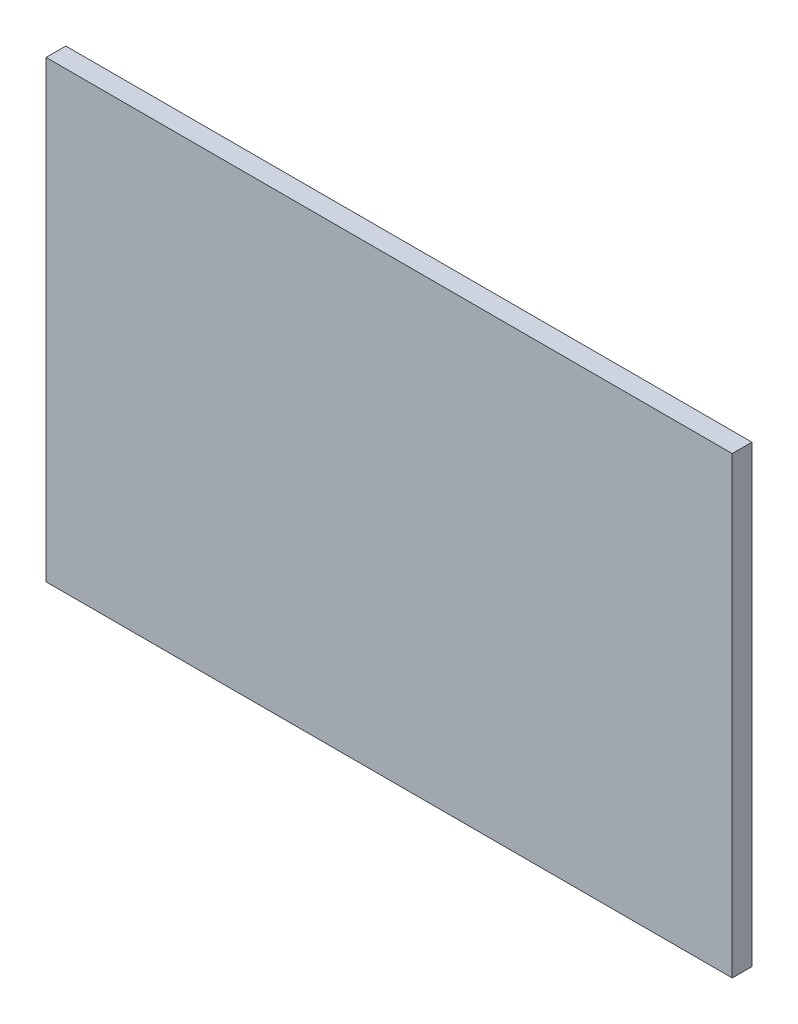
ISO-10303-21;
HEADER;
FILE_DESCRIPTION(('STEP AP214'),'2;1');
FILE_NAME('part.step','',(''),(''),'','','');
FILE_SCHEMA(('AUTOMOTIVE_DESIGN { 1 0 10303 214 1 1 1 1 }'));
ENDSEC;
DATA;
#1=APPLICATION_CONTEXT('core data for automotive mechanical design processes');
#2=APPLICATION_PROTOCOL_DEFINITION('international standard','automotive_design',2000,#1);
#3=PRODUCT_CONTEXT('',#1,'mechanical');
#4=PRODUCT('Part','Part','',(#3));
#5=PRODUCT_RELATED_PRODUCT_CATEGORY('part','',(#4));
#6=PRODUCT_DEFINITION_FORMATION('','',#4);
#7=PRODUCT_DEFINITION_CONTEXT('part definition',#1,'design');
#8=PRODUCT_DEFINITION('design','',#6,#7);
#9=PRODUCT_DEFINITION_SHAPE('','',#8);
#10=(LENGTH_UNIT() NAMED_UNIT(*) SI_UNIT(.MILLI.,.METRE.));
#11=(NAMED_UNIT(*) PLANE_ANGLE_UNIT() SI_UNIT($,.RADIAN.));
#12=(NAMED_UNIT(*) SI_UNIT($,.STERADIAN.) SOLID_ANGLE_UNIT());
#13=UNCERTAINTY_MEASURE_WITH_UNIT(LENGTH_MEASURE(1.E-05),#10,'distance_accuracy_value','');
#14=(GEOMETRIC_REPRESENTATION_CONTEXT(3) GLOBAL_UNCERTAINTY_ASSIGNED_CONTEXT((#13)) GLOBAL_UNIT_ASSIGNED_CONTEXT((#10,
#11,#12)) REPRESENTATION_CONTEXT('',''));
#15=CARTESIAN_POINT('',(0.,0.,0.));
#16=DIRECTION('',(0.,0.,1.));
#17=DIRECTION('',(1.,0.,0.));
#18=AXIS2_PLACEMENT_3D('',#15,#16,#17);
#19=CARTESIAN_POINT('',(0.,0.,12.));
#20=DIRECTION('',(1.,0.,0.));
#21=DIRECTION('',(0.,0.,-1.));
#22=AXIS2_PLACEMENT_3D('',#19,#20,#21);
#23=PLANE('',#22);
#24=DIRECTION('',(0.,-1.,0.));
#25=VECTOR('',#24,1.);
#26=CARTESIAN_POINT('',(0.,0.,0.));
#27=LINE('',#26,#25);
#28=CARTESIAN_POINT('',(0.,276.,0.));
#29=VERTEX_POINT('',#28);
#30=CARTESIAN_POINT('',(0.,0.,0.));
#31=VERTEX_POINT('',#30);
#32=EDGE_CURVE('E96',#29,#31,#27,.T.);
#33=ORIENTED_EDGE('',*,*,#32,.T.);
#34=DIRECTION('',(0.,0.,-1.));
#35=VECTOR('',#34,1.);
#36=CARTESIAN_POINT('',(0.,0.,12.));
#37=LINE('',#36,#35);
#38=CARTESIAN_POINT('',(0.,0.,12.));
#39=VERTEX_POINT('',#38);
#40=EDGE_CURVE('E11',#39,#31,#37,.T.);
#41=ORIENTED_EDGE('',*,*,#40,.F.);
#42=DIRECTION('',(0.,-1.,0.));
#43=VECTOR('',#42,1.);
#44=CARTESIAN_POINT('',(0.,0.,12.));
#45=LINE('',#44,#43);
#46=CARTESIAN_POINT('',(0.,276.,12.));
#47=VERTEX_POINT('',#46);
#48=EDGE_CURVE('E84',#47,#39,#45,.T.);
#49=ORIENTED_EDGE('',*,*,#48,.F.);
#50=DIRECTION('',(0.,0.,-1.));
#51=VECTOR('',#50,1.);
#52=CARTESIAN_POINT('',(0.,276.,12.));
#53=LINE('',#52,#51);
#54=EDGE_CURVE('E92',#47,#29,#53,.T.);
#55=ORIENTED_EDGE('',*,*,#54,.T.);
#56=EDGE_LOOP('',(#33,#41,#49,#55));
#57=FACE_BOUND('',#56,.T.);
#58=ADVANCED_FACE('F33',(#57),#23,.F.);
#59=CARTESIAN_POINT('',(0.,0.,12.));
#60=DIRECTION('',(0.,1.,0.));
#61=DIRECTION('',(0.,0.,1.));
#62=AXIS2_PLACEMENT_3D('',#59,#60,#61);
#63=PLANE('',#62);
#64=DIRECTION('',(1.,0.,0.));
#65=VECTOR('',#64,1.);
#66=CARTESIAN_POINT('',(0.,0.,0.));
#67=LINE('',#66,#65);
#68=CARTESIAN_POINT('',(417.,0.,0.));
#69=VERTEX_POINT('',#68);
#70=EDGE_CURVE('E88',#31,#69,#67,.T.);
#71=ORIENTED_EDGE('',*,*,#70,.T.);
#72=DIRECTION('',(0.,0.,-1.));
#73=VECTOR('',#72,1.);
#74=CARTESIAN_POINT('',(417.,0.,12.));
#75=LINE('',#74,#73);
#76=CARTESIAN_POINT('',(417.,0.,12.));
#77=VERTEX_POINT('',#76);
#78=EDGE_CURVE('E41',#77,#69,#75,.T.);
#79=ORIENTED_EDGE('',*,*,#78,.F.);
#80=DIRECTION('',(1.,0.,0.));
#81=VECTOR('',#80,1.);
#82=CARTESIAN_POINT('',(0.,0.,12.));
#83=LINE('',#82,#81);
#84=EDGE_CURVE('E79',#39,#77,#83,.T.);
#85=ORIENTED_EDGE('',*,*,#84,.F.);
#86=ORIENTED_EDGE('',*,*,#40,.T.);
#87=EDGE_LOOP('',(#71,#79,#85,#86));
#88=FACE_BOUND('',#87,.T.);
#89=ADVANCED_FACE('F87',(#88),#63,.F.);
#90=CARTESIAN_POINT('',(417.,0.,12.));
#91=DIRECTION('',(-1.,0.,0.));
#92=DIRECTION('',(0.,0.,1.));
#93=AXIS2_PLACEMENT_3D('',#90,#91,#92);
#94=PLANE('',#93);
#95=DIRECTION('',(0.,1.,0.));
#96=VECTOR('',#95,1.);
#97=CARTESIAN_POINT('',(417.,0.,0.));
#98=LINE('',#97,#96);
#99=CARTESIAN_POINT('',(417.,276.,0.));
#100=VERTEX_POINT('',#99);
#101=EDGE_CURVE('E66',#69,#100,#98,.T.);
#102=ORIENTED_EDGE('',*,*,#101,.T.);
#103=DIRECTION('',(0.,0.,-1.));
#104=VECTOR('',#103,1.);
#105=CARTESIAN_POINT('',(417.,276.,12.));
#106=LINE('',#105,#104);
#107=CARTESIAN_POINT('',(417.,276.,12.));
#108=VERTEX_POINT('',#107);
#109=EDGE_CURVE('E89',#108,#100,#106,.T.);
#110=ORIENTED_EDGE('',*,*,#109,.F.);
#111=DIRECTION('',(0.,1.,0.));
#112=VECTOR('',#111,1.);
#113=CARTESIAN_POINT('',(417.,0.,12.));
#114=LINE('',#113,#112);
#115=EDGE_CURVE('E82',#77,#108,#114,.T.);
#116=ORIENTED_EDGE('',*,*,#115,.F.);
#117=ORIENTED_EDGE('',*,*,#78,.T.);
#118=EDGE_LOOP('',(#102,#110,#116,#117));
#119=FACE_BOUND('',#118,.T.);
#120=ADVANCED_FACE('F90',(#119),#94,.F.);
#121=CARTESIAN_POINT('',(0.,276.,12.));
#122=DIRECTION('',(0.,-1.,0.));
#123=DIRECTION('',(0.,0.,-1.));
#124=AXIS2_PLACEMENT_3D('',#121,#122,#123);
#125=PLANE('',#124);
#126=DIRECTION('',(-1.,0.,0.));
#127=VECTOR('',#126,1.);
#128=CARTESIAN_POINT('',(0.,276.,0.));
#129=LINE('',#128,#127);
#130=EDGE_CURVE('E72',#100,#29,#129,.T.);
#131=ORIENTED_EDGE('',*,*,#130,.T.);
#132=ORIENTED_EDGE('',*,*,#54,.F.);
#133=DIRECTION('',(-1.,0.,0.));
#134=VECTOR('',#133,1.);
#135=CARTESIAN_POINT('',(0.,276.,12.));
#136=LINE('',#135,#134);
#137=EDGE_CURVE('E49',#108,#47,#136,.T.);
#138=ORIENTED_EDGE('',*,*,#137,.F.);
#139=ORIENTED_EDGE('',*,*,#109,.T.);
#140=EDGE_LOOP('',(#131,#132,#138,#139));
#141=FACE_BOUND('',#140,.T.);
#142=ADVANCED_FACE('F103',(#141),#125,.F.);
#143=CARTESIAN_POINT('',(0.,0.,12.));
#144=DIRECTION('',(0.,0.,-1.));
#145=DIRECTION('',(-1.,0.,0.));
#146=AXIS2_PLACEMENT_3D('',#143,#144,#145);
#147=PLANE('',#146);
#148=ORIENTED_EDGE('',*,*,#48,.T.);
#149=ORIENTED_EDGE('',*,*,#84,.T.);
#150=ORIENTED_EDGE('',*,*,#115,.T.);
#151=ORIENTED_EDGE('',*,*,#137,.T.);
#152=EDGE_LOOP('',(#148,#149,#150,#151));
#153=FACE_BOUND('',#152,.T.);
#154=ADVANCED_FACE('F80',(#153),#147,.F.);
#155=CARTESIAN_POINT('',(0.,0.,0.));
#156=DIRECTION('',(0.,0.,-1.));
#157=DIRECTION('',(-1.,0.,0.));
#158=AXIS2_PLACEMENT_3D('',#155,#156,#157);
#159=PLANE('',#158);
#160=ORIENTED_EDGE('',*,*,#32,.F.);
#161=ORIENTED_EDGE('',*,*,#130,.F.);
#162=ORIENTED_EDGE('',*,*,#101,.F.);
#163=ORIENTED_EDGE('',*,*,#70,.F.);
#164=EDGE_LOOP('',(#160,#161,#162,#163));
#165=FACE_BOUND('',#164,.T.);
#166=ADVANCED_FACE('F106',(#165),#159,.T.);
#167=CLOSED_SHELL('',(#58,#89,#120,#142,#154,#166));
#168=MANIFOLD_SOLID_BREP('B2',#167);
#169=ADVANCED_BREP_SHAPE_REPRESENTATION('',(#18,#168),#14);
#170=SHAPE_DEFINITION_REPRESENTATION(#9,#169);
ENDSEC;
END-ISO-10303-21;
